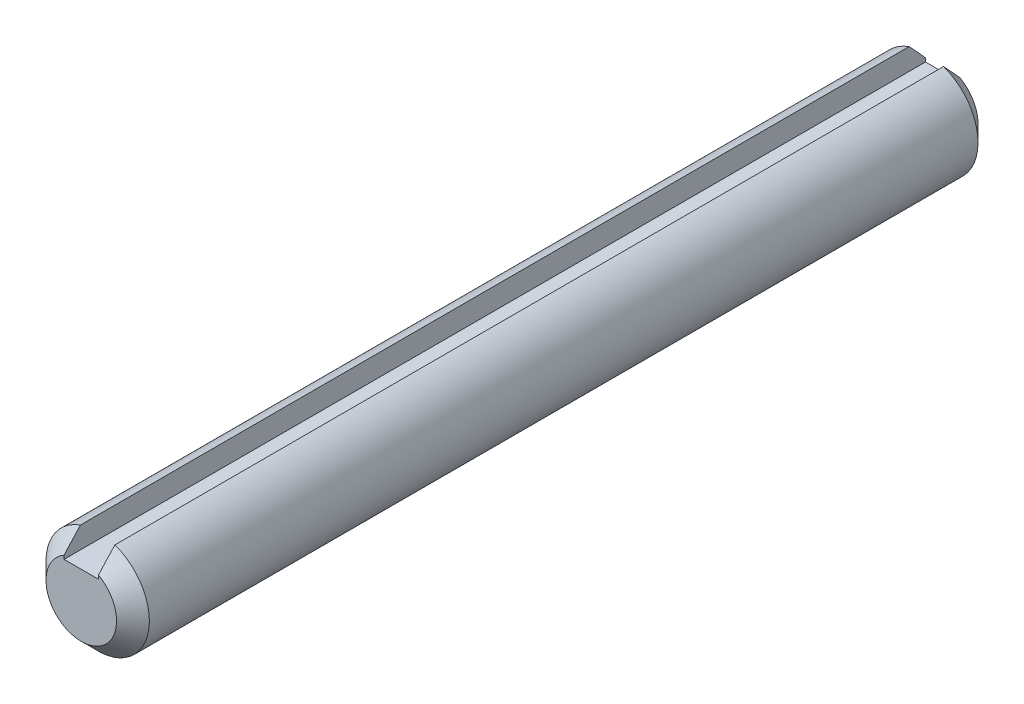
ISO-10303-21;
HEADER;
FILE_DESCRIPTION(('STEP AP214'),'2;1');
FILE_NAME('part.step','',(''),(''),'','','');
FILE_SCHEMA(('AUTOMOTIVE_DESIGN { 1 0 10303 214 1 1 1 1 }'));
ENDSEC;
DATA;
#1=APPLICATION_CONTEXT('core data for automotive mechanical design processes');
#2=APPLICATION_PROTOCOL_DEFINITION('international standard','automotive_design',2000,#1);
#3=PRODUCT_CONTEXT('',#1,'mechanical');
#4=PRODUCT('Part','Part','',(#3));
#5=PRODUCT_RELATED_PRODUCT_CATEGORY('part','',(#4));
#6=PRODUCT_DEFINITION_FORMATION('','',#4);
#7=PRODUCT_DEFINITION_CONTEXT('part definition',#1,'design');
#8=PRODUCT_DEFINITION('design','',#6,#7);
#9=PRODUCT_DEFINITION_SHAPE('','',#8);
#10=(LENGTH_UNIT() NAMED_UNIT(*) SI_UNIT(.MILLI.,.METRE.));
#11=(NAMED_UNIT(*) PLANE_ANGLE_UNIT() SI_UNIT($,.RADIAN.));
#12=(NAMED_UNIT(*) SI_UNIT($,.STERADIAN.) SOLID_ANGLE_UNIT());
#13=UNCERTAINTY_MEASURE_WITH_UNIT(LENGTH_MEASURE(1.E-05),#10,'distance_accuracy_value','');
#14=(GEOMETRIC_REPRESENTATION_CONTEXT(3) GLOBAL_UNCERTAINTY_ASSIGNED_CONTEXT((#13)) GLOBAL_UNIT_ASSIGNED_CONTEXT((#10,
#11,#12)) REPRESENTATION_CONTEXT('',''));
#15=CARTESIAN_POINT('',(0.,0.,0.));
#16=DIRECTION('',(0.,0.,1.));
#17=DIRECTION('',(1.,0.,0.));
#18=AXIS2_PLACEMENT_3D('',#15,#16,#17);
#19=CARTESIAN_POINT('',(0.,0.,100.));
#20=DIRECTION('',(0.,0.,-1.));
#21=DIRECTION('',(-1.,0.,0.));
#22=AXIS2_PLACEMENT_3D('',#19,#20,#21);
#23=CYLINDRICAL_SURFACE('',#22,6.);
#24=DIRECTION('',(0.,0.,-1.));
#25=VECTOR('',#24,1.);
#26=CARTESIAN_POINT('',(2.,5.65685424949238,100.));
#27=LINE('',#26,#25);
#28=CARTESIAN_POINT('',(2.,5.65685424949238,98.095));
#29=VERTEX_POINT('',#28);
#30=CARTESIAN_POINT('',(2.,5.65685424949238,1.90500000000002));
#31=VERTEX_POINT('',#30);
#32=EDGE_CURVE('E115',#29,#31,#27,.T.);
#33=ORIENTED_EDGE('',*,*,#32,.F.);
#34=CARTESIAN_POINT('',(0.,0.,98.095));
#35=DIRECTION('',(0.,0.,1.));
#36=DIRECTION('',(1.,0.,0.));
#37=AXIS2_PLACEMENT_3D('',#34,#35,#36);
#38=CIRCLE('',#37,6.);
#39=CARTESIAN_POINT('',(-2.,5.65685424949238,98.095));
#40=VERTEX_POINT('',#39);
#41=EDGE_CURVE('E246',#29,#40,#38,.F.);
#42=ORIENTED_EDGE('',*,*,#41,.T.);
#43=DIRECTION('',(0.,0.,-1.));
#44=VECTOR('',#43,1.);
#45=CARTESIAN_POINT('',(-2.,5.65685424949238,100.));
#46=LINE('',#45,#44);
#47=CARTESIAN_POINT('',(-2.,5.65685424949238,1.90500000000002));
#48=VERTEX_POINT('',#47);
#49=EDGE_CURVE('E125',#40,#48,#46,.T.);
#50=ORIENTED_EDGE('',*,*,#49,.T.);
#51=CARTESIAN_POINT('',(0.,0.,1.90500000000002));
#52=DIRECTION('',(0.,0.,1.));
#53=DIRECTION('',(1.,0.,0.));
#54=AXIS2_PLACEMENT_3D('',#51,#52,#53);
#55=CIRCLE('',#54,6.);
#56=EDGE_CURVE('E244',#48,#31,#55,.T.);
#57=ORIENTED_EDGE('',*,*,#56,.T.);
#58=EDGE_LOOP('',(#33,#42,#50,#57));
#59=FACE_BOUND('',#58,.T.);
#60=ADVANCED_FACE('F39',(#59),#23,.T.);
#61=CARTESIAN_POINT('',(2.,3.15685424949238,100.));
#62=DIRECTION('',(1.,0.,0.));
#63=DIRECTION('',(0.,0.,-1.));
#64=AXIS2_PLACEMENT_3D('',#61,#62,#63);
#65=PLANE('',#64);
#66=DIRECTION('',(0.,-1.,0.));
#67=VECTOR('',#66,1.);
#68=CARTESIAN_POINT('',(2.,3.15685424949238,100.));
#69=LINE('',#68,#67);
#70=CARTESIAN_POINT('',(2.,3.5733772540833,100.));
#71=VERTEX_POINT('',#70);
#72=CARTESIAN_POINT('',(2.,3.15685424949238,100.));
#73=VERTEX_POINT('',#72);
#74=EDGE_CURVE('E95',#71,#73,#69,.T.);
#75=ORIENTED_EDGE('',*,*,#74,.F.);
#76=CARTESIAN_POINT('',(2.,3.5733772540833,100.));
#77=CARTESIAN_POINT('',(2.,3.66201567894491,99.9226444570359));
#78=CARTESIAN_POINT('',(2.,3.75032113936976,99.8449094980047));
#79=CARTESIAN_POINT('',(2.,3.92635948599866,99.6887965245481));
#80=CARTESIAN_POINT('',(2.,4.01409238145401,99.6104185205592));
#81=CARTESIAN_POINT('',(2.,4.27656153291964,99.3745033061836));
#82=CARTESIAN_POINT('',(2.,4.45058342099022,99.2161715893908));
#83=CARTESIAN_POINT('',(2.,4.79723356765976,98.8980098802683));
#84=CARTESIAN_POINT('',(2.,4.96986188883333,98.7381799559162));
#85=CARTESIAN_POINT('',(2.,5.31406883918445,98.4173634992947));
#86=CARTESIAN_POINT('',(2.,5.48564737705002,98.2563768689882));
#87=CARTESIAN_POINT('',(2.,5.65685424949238,98.095));
#88=B_SPLINE_CURVE_WITH_KNOTS('',3,(#76,#77,#78,#79,#80,#81,#82,#83,#84,#85,#86,#87),
.UNSPECIFIED.,.F.,.F.,(4,2,2,2,2,4),(0.,0.352935707067704,0.705865697329398,1.41166515740603,
2.11743274706682,2.82326087693101),.UNSPECIFIED.);
#89=EDGE_CURVE('E152',#71,#29,#88,.T.);
#90=ORIENTED_EDGE('',*,*,#89,.T.);
#91=ORIENTED_EDGE('',*,*,#32,.T.);
#92=CARTESIAN_POINT('',(2.,5.65685424949238,1.90500000000002));
#93=CARTESIAN_POINT('',(2.,5.48564737705002,1.74362313101178));
#94=CARTESIAN_POINT('',(2.,5.31406883918445,1.58263650070535));
#95=CARTESIAN_POINT('',(2.,4.96986188883332,1.26182004408375));
#96=CARTESIAN_POINT('',(2.,4.79723356765975,1.10199011973169));
#97=CARTESIAN_POINT('',(2.,4.4505834209902,0.783828410609251));
#98=CARTESIAN_POINT('',(2.,4.27656153291963,0.62549669381642));
#99=CARTESIAN_POINT('',(2.,4.014092381454,0.389581479440835));
#100=CARTESIAN_POINT('',(2.,3.92635948599865,0.311203475451893));
#101=CARTESIAN_POINT('',(2.,3.75032113936975,0.15509050199529));
#102=CARTESIAN_POINT('',(2.,3.6620156789449,0.0773555429641511));
#103=CARTESIAN_POINT('',(2.,3.57337725408328,0.));
#104=B_SPLINE_CURVE_WITH_KNOTS('',3,(#92,#93,#94,#95,#96,#97,#98,#99,#100,#101,#102,#103),
.UNSPECIFIED.,.F.,.F.,(4,2,2,2,2,4),(0.,0.705828129864204,1.41159571952498,2.11739517960162,
2.4703251698633,2.82326087693102),.UNSPECIFIED.);
#105=CARTESIAN_POINT('',(2.,3.57337725408328,0.));
#106=VERTEX_POINT('',#105);
#107=EDGE_CURVE('E144',#31,#106,#104,.T.);
#108=ORIENTED_EDGE('',*,*,#107,.T.);
#109=DIRECTION('',(0.,-1.,0.));
#110=VECTOR('',#109,1.);
#111=CARTESIAN_POINT('',(2.,3.15685424949238,0.));
#112=LINE('',#111,#110);
#113=CARTESIAN_POINT('',(2.,3.15685424949238,0.));
#114=VERTEX_POINT('',#113);
#115=EDGE_CURVE('E111',#106,#114,#112,.T.);
#116=ORIENTED_EDGE('',*,*,#115,.T.);
#117=DIRECTION('',(0.,0.,-1.));
#118=VECTOR('',#117,1.);
#119=CARTESIAN_POINT('',(2.,3.15685424949238,100.));
#120=LINE('',#119,#118);
#121=EDGE_CURVE('E109',#73,#114,#120,.T.);
#122=ORIENTED_EDGE('',*,*,#121,.F.);
#123=EDGE_LOOP('',(#75,#90,#91,#108,#116,#122));
#124=FACE_BOUND('',#123,.T.);
#125=ADVANCED_FACE('F110',(#124),#65,.F.);
#126=CARTESIAN_POINT('',(2.,3.15685424949238,100.));
#127=DIRECTION('',(0.,-1.,0.));
#128=DIRECTION('',(1.,0.,0.));
#129=AXIS2_PLACEMENT_3D('',#126,#127,#128);
#130=PLANE('',#129);
#131=DIRECTION('',(-1.,0.,0.));
#132=VECTOR('',#131,1.);
#133=CARTESIAN_POINT('',(2.,3.15685424949238,0.));
#134=LINE('',#133,#132);
#135=CARTESIAN_POINT('',(-2.,3.15685424949238,0.));
#136=VERTEX_POINT('',#135);
#137=EDGE_CURVE('E130',#114,#136,#134,.T.);
#138=ORIENTED_EDGE('',*,*,#137,.T.);
#139=DIRECTION('',(0.,0.,-1.));
#140=VECTOR('',#139,1.);
#141=CARTESIAN_POINT('',(-2.,3.15685424949238,100.));
#142=LINE('',#141,#140);
#143=CARTESIAN_POINT('',(-2.,3.15685424949238,100.));
#144=VERTEX_POINT('',#143);
#145=EDGE_CURVE('E116',#144,#136,#142,.T.);
#146=ORIENTED_EDGE('',*,*,#145,.F.);
#147=DIRECTION('',(-1.,0.,0.));
#148=VECTOR('',#147,1.);
#149=CARTESIAN_POINT('',(2.,3.15685424949238,100.));
#150=LINE('',#149,#148);
#151=EDGE_CURVE('E100',#73,#144,#150,.T.);
#152=ORIENTED_EDGE('',*,*,#151,.F.);
#153=ORIENTED_EDGE('',*,*,#121,.T.);
#154=EDGE_LOOP('',(#138,#146,#152,#153));
#155=FACE_BOUND('',#154,.T.);
#156=ADVANCED_FACE('F118',(#155),#130,.F.);
#157=CARTESIAN_POINT('',(-2.,3.15685424949238,100.));
#158=DIRECTION('',(-1.,0.,0.));
#159=DIRECTION('',(0.,0.,1.));
#160=AXIS2_PLACEMENT_3D('',#157,#158,#159);
#161=PLANE('',#160);
#162=ORIENTED_EDGE('',*,*,#49,.F.);
#163=CARTESIAN_POINT('',(-2.,5.65685424949238,98.095));
#164=CARTESIAN_POINT('',(-2.,5.48564737705002,98.2563768689882));
#165=CARTESIAN_POINT('',(-2.,5.31406883918445,98.4173634992947));
#166=CARTESIAN_POINT('',(-2.,4.96986188883333,98.7381799559162));
#167=CARTESIAN_POINT('',(-2.,4.79723356765976,98.8980098802683));
#168=CARTESIAN_POINT('',(-2.,4.45058342099022,99.2161715893908));
#169=CARTESIAN_POINT('',(-2.,4.27656153291964,99.3745033061836));
#170=CARTESIAN_POINT('',(-2.,4.01409238145401,99.6104185205592));
#171=CARTESIAN_POINT('',(-2.,3.92635948599865,99.6887965245481));
#172=CARTESIAN_POINT('',(-2.,3.75032113936976,99.8449094980047));
#173=CARTESIAN_POINT('',(-2.,3.66201567894491,99.9226444570359));
#174=CARTESIAN_POINT('',(-2.,3.57337725408329,100.));
#175=B_SPLINE_CURVE_WITH_KNOTS('',3,(#163,#164,#165,#166,#167,#168,#169,#170,#171,#172,#173,
#174),.UNSPECIFIED.,.F.,.F.,(4,2,2,2,2,4),(0.,0.70582812986419,1.41159571952498,
2.11739517960161,2.4703251698633,2.82326087693101),.UNSPECIFIED.);
#176=CARTESIAN_POINT('',(-2.,3.5733772540833,100.));
#177=VERTEX_POINT('',#176);
#178=EDGE_CURVE('E49',#40,#177,#175,.T.);
#179=ORIENTED_EDGE('',*,*,#178,.T.);
#180=DIRECTION('',(0.,1.,0.));
#181=VECTOR('',#180,1.);
#182=CARTESIAN_POINT('',(-2.,3.15685424949238,100.));
#183=LINE('',#182,#181);
#184=EDGE_CURVE('E122',#144,#177,#183,.T.);
#185=ORIENTED_EDGE('',*,*,#184,.F.);
#186=ORIENTED_EDGE('',*,*,#145,.T.);
#187=DIRECTION('',(0.,1.,0.));
#188=VECTOR('',#187,1.);
#189=CARTESIAN_POINT('',(-2.,3.15685424949238,0.));
#190=LINE('',#189,#188);
#191=CARTESIAN_POINT('',(-2.,3.57337725408328,0.));
#192=VERTEX_POINT('',#191);
#193=EDGE_CURVE('E106',#136,#192,#190,.T.);
#194=ORIENTED_EDGE('',*,*,#193,.T.);
#195=CARTESIAN_POINT('',(-2.,3.57337725408328,0.));
#196=CARTESIAN_POINT('',(-2.,3.6620156789449,0.0773555429641514));
#197=CARTESIAN_POINT('',(-2.,3.75032113936975,0.15509050199529));
#198=CARTESIAN_POINT('',(-2.,3.92635948599865,0.311203475451893));
#199=CARTESIAN_POINT('',(-2.,4.014092381454,0.389581479440836));
#200=CARTESIAN_POINT('',(-2.,4.27656153291963,0.62549669381642));
#201=CARTESIAN_POINT('',(-2.,4.4505834209902,0.783828410609251));
#202=CARTESIAN_POINT('',(-2.,4.79723356765975,1.10199011973169));
#203=CARTESIAN_POINT('',(-2.,4.96986188883331,1.26182004408375));
#204=CARTESIAN_POINT('',(-2.,5.31406883918445,1.58263650070534));
#205=CARTESIAN_POINT('',(-2.,5.48564737705002,1.74362313101178));
#206=CARTESIAN_POINT('',(-2.,5.65685424949238,1.90500000000002));
#207=B_SPLINE_CURVE_WITH_KNOTS('',3,(#195,#196,#197,#198,#199,#200,#201,#202,#203,#204,#205,
#206),.UNSPECIFIED.,.F.,.F.,(4,2,2,2,2,4),(0.,0.352935707067715,0.705865697329395,
1.41166515740604,2.11743274706681,2.82326087693102),.UNSPECIFIED.);
#208=EDGE_CURVE('E61',#192,#48,#207,.T.);
#209=ORIENTED_EDGE('',*,*,#208,.T.);
#210=EDGE_LOOP('',(#162,#179,#185,#186,#194,#209));
#211=FACE_BOUND('',#210,.T.);
#212=ADVANCED_FACE('F183',(#211),#161,.F.);
#213=CARTESIAN_POINT('',(0.,0.,100.));
#214=DIRECTION('',(0.,0.,1.));
#215=DIRECTION('',(1.,0.,0.));
#216=AXIS2_PLACEMENT_3D('',#213,#214,#215);
#217=PLANE('',#216);
#218=ORIENTED_EDGE('',*,*,#184,.T.);
#219=CARTESIAN_POINT('',(0.,0.,100.));
#220=DIRECTION('',(0.,0.,1.));
#221=DIRECTION('',(1.,0.,0.));
#222=AXIS2_PLACEMENT_3D('',#219,#220,#221);
#223=CIRCLE('',#222,4.09499999999999);
#224=EDGE_CURVE('E103',#177,#71,#223,.T.);
#225=ORIENTED_EDGE('',*,*,#224,.T.);
#226=ORIENTED_EDGE('',*,*,#74,.T.);
#227=ORIENTED_EDGE('',*,*,#151,.T.);
#228=EDGE_LOOP('',(#218,#225,#226,#227));
#229=FACE_BOUND('',#228,.T.);
#230=ADVANCED_FACE('F98',(#229),#217,.T.);
#231=CARTESIAN_POINT('',(0.,0.,0.));
#232=DIRECTION('',(0.,0.,1.));
#233=DIRECTION('',(1.,0.,0.));
#234=AXIS2_PLACEMENT_3D('',#231,#232,#233);
#235=PLANE('',#234);
#236=ORIENTED_EDGE('',*,*,#115,.F.);
#237=CARTESIAN_POINT('',(0.,0.,0.));
#238=DIRECTION('',(0.,0.,1.));
#239=DIRECTION('',(1.,0.,0.));
#240=AXIS2_PLACEMENT_3D('',#237,#238,#239);
#241=CIRCLE('',#240,4.09499999999997);
#242=EDGE_CURVE('E11',#106,#192,#241,.F.);
#243=ORIENTED_EDGE('',*,*,#242,.T.);
#244=ORIENTED_EDGE('',*,*,#193,.F.);
#245=ORIENTED_EDGE('',*,*,#137,.F.);
#246=EDGE_LOOP('',(#236,#243,#244,#245));
#247=FACE_BOUND('',#246,.T.);
#248=ADVANCED_FACE('F169',(#247),#235,.F.);
#249=CARTESIAN_POINT('',(0.,0.,100.));
#250=DIRECTION('',(0.,0.,-1.));
#251=DIRECTION('',(-1.,0.,0.));
#252=AXIS2_PLACEMENT_3D('',#249,#250,#251);
#253=CONICAL_SURFACE('',#252,4.09499999999999,0.785398163397447);
#254=ORIENTED_EDGE('',*,*,#178,.F.);
#255=ORIENTED_EDGE('',*,*,#41,.F.);
#256=ORIENTED_EDGE('',*,*,#89,.F.);
#257=ORIENTED_EDGE('',*,*,#224,.F.);
#258=EDGE_LOOP('',(#254,#255,#256,#257));
#259=FACE_BOUND('',#258,.T.);
#260=ADVANCED_FACE('F166',(#259),#253,.T.);
#261=CARTESIAN_POINT('',(0.,0.,1.90500000000002));
#262=DIRECTION('',(0.,0.,1.));
#263=DIRECTION('',(1.,0.,0.));
#264=AXIS2_PLACEMENT_3D('',#261,#262,#263);
#265=CONICAL_SURFACE('',#264,6.,0.78539816339745);
#266=ORIENTED_EDGE('',*,*,#208,.F.);
#267=ORIENTED_EDGE('',*,*,#242,.F.);
#268=ORIENTED_EDGE('',*,*,#107,.F.);
#269=ORIENTED_EDGE('',*,*,#56,.F.);
#270=EDGE_LOOP('',(#266,#267,#268,#269));
#271=FACE_BOUND('',#270,.T.);
#272=ADVANCED_FACE('F41',(#271),#265,.T.);
#273=CLOSED_SHELL('',(#60,#125,#156,#212,#230,#248,#260,#272));
#274=MANIFOLD_SOLID_BREP('B2',#273);
#275=ADVANCED_BREP_SHAPE_REPRESENTATION('',(#18,#274),#14);
#276=SHAPE_DEFINITION_REPRESENTATION(#9,#275);
ENDSEC;
END-ISO-10303-21;
